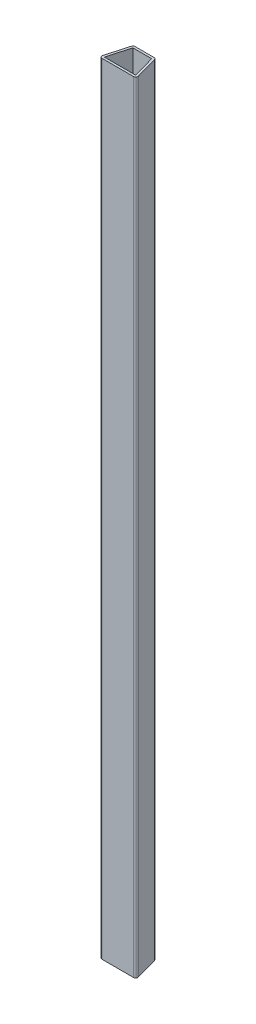
ISO-10303-21;
HEADER;
FILE_DESCRIPTION(('STEP AP214'),'2;1');
FILE_NAME('part.step','',(''),(''),'','','');
FILE_SCHEMA(('AUTOMOTIVE_DESIGN { 1 0 10303 214 1 1 1 1 }'));
ENDSEC;
DATA;
#1=APPLICATION_CONTEXT('core data for automotive mechanical design processes');
#2=APPLICATION_PROTOCOL_DEFINITION('international standard','automotive_design',2000,#1);
#3=PRODUCT_CONTEXT('',#1,'mechanical');
#4=PRODUCT('Part','Part','',(#3));
#5=PRODUCT_RELATED_PRODUCT_CATEGORY('part','',(#4));
#6=PRODUCT_DEFINITION_FORMATION('','',#4);
#7=PRODUCT_DEFINITION_CONTEXT('part definition',#1,'design');
#8=PRODUCT_DEFINITION('design','',#6,#7);
#9=PRODUCT_DEFINITION_SHAPE('','',#8);
#10=(LENGTH_UNIT() NAMED_UNIT(*) SI_UNIT(.MILLI.,.METRE.));
#11=(NAMED_UNIT(*) PLANE_ANGLE_UNIT() SI_UNIT($,.RADIAN.));
#12=(NAMED_UNIT(*) SI_UNIT($,.STERADIAN.) SOLID_ANGLE_UNIT());
#13=UNCERTAINTY_MEASURE_WITH_UNIT(LENGTH_MEASURE(1.E-05),#10,'distance_accuracy_value','');
#14=(GEOMETRIC_REPRESENTATION_CONTEXT(3) GLOBAL_UNCERTAINTY_ASSIGNED_CONTEXT((#13)) GLOBAL_UNIT_ASSIGNED_CONTEXT((#10,
#11,#12)) REPRESENTATION_CONTEXT('',''));
#15=CARTESIAN_POINT('',(0.,0.,0.));
#16=DIRECTION('',(0.,0.,1.));
#17=DIRECTION('',(1.,0.,0.));
#18=AXIS2_PLACEMENT_3D('',#15,#16,#17);
#19=CARTESIAN_POINT('',(-7.0398555990135,350.,5.));
#20=DIRECTION('',(0.,1.,0.));
#21=DIRECTION('',(0.,0.,1.));
#22=AXIS2_PLACEMENT_3D('',#19,#20,#21);
#23=PLANE('',#22);
#24=CARTESIAN_POINT('',(-7.0398555990135,350.,5.));
#25=DIRECTION('',(0.,1.,0.));
#26=DIRECTION('',(0.,0.,1.));
#27=AXIS2_PLACEMENT_3D('',#24,#25,#26);
#28=CIRCLE('',#27,1.);
#29=CARTESIAN_POINT('',(-8.0025065391674,350.,4.72925442308171));
#30=VERTEX_POINT('',#29);
#31=CARTESIAN_POINT('',(-7.03985559901349,350.,6.));
#32=VERTEX_POINT('',#31);
#33=EDGE_CURVE('E165',#30,#32,#28,.T.);
#34=ORIENTED_EDGE('',*,*,#33,.T.);
#35=DIRECTION('',(1.,0.,0.));
#36=VECTOR('',#35,1.);
#37=CARTESIAN_POINT('',(-7.03985559901349,350.,6.));
#38=LINE('',#37,#36);
#39=CARTESIAN_POINT('',(7.03985559901349,350.,6.));
#40=VERTEX_POINT('',#39);
#41=EDGE_CURVE('E164',#32,#40,#38,.T.);
#42=ORIENTED_EDGE('',*,*,#41,.T.);
#43=CARTESIAN_POINT('',(7.0398555990135,350.,5.));
#44=DIRECTION('',(0.,1.,0.));
#45=DIRECTION('',(0.,0.,-1.));
#46=AXIS2_PLACEMENT_3D('',#43,#44,#45);
#47=CIRCLE('',#46,1.);
#48=CARTESIAN_POINT('',(8.0025065391674,350.,4.72925442308171));
#49=VERTEX_POINT('',#48);
#50=EDGE_CURVE('E169',#40,#49,#47,.T.);
#51=ORIENTED_EDGE('',*,*,#50,.T.);
#52=DIRECTION('',(-0.270745576918284,0.,-0.962650940153899));
#53=VECTOR('',#52,1.);
#54=CARTESIAN_POINT('',(5.1900065391674,350.,-5.27074557691828));
#55=LINE('',#54,#53);
#56=CARTESIAN_POINT('',(5.1900065391674,350.,-5.27074557691828));
#57=VERTEX_POINT('',#56);
#58=EDGE_CURVE('E168',#49,#57,#55,.T.);
#59=ORIENTED_EDGE('',*,*,#58,.T.);
#60=CARTESIAN_POINT('',(4.2273555990135,350.,-5.));
#61=DIRECTION('',(0.,1.,0.));
#62=DIRECTION('',(0.,0.,1.));
#63=AXIS2_PLACEMENT_3D('',#60,#61,#62);
#64=CIRCLE('',#63,1.);
#65=CARTESIAN_POINT('',(4.22735559901349,350.,-6.));
#66=VERTEX_POINT('',#65);
#67=EDGE_CURVE('E175',#57,#66,#64,.T.);
#68=ORIENTED_EDGE('',*,*,#67,.T.);
#69=DIRECTION('',(-1.,0.,0.));
#70=VECTOR('',#69,1.);
#71=CARTESIAN_POINT('',(-4.22735559901349,350.,-6.));
#72=LINE('',#71,#70);
#73=CARTESIAN_POINT('',(-4.22735559901349,350.,-6.));
#74=VERTEX_POINT('',#73);
#75=EDGE_CURVE('E171',#66,#74,#72,.T.);
#76=ORIENTED_EDGE('',*,*,#75,.T.);
#77=CARTESIAN_POINT('',(-4.2273555990135,350.,-5.));
#78=DIRECTION('',(0.,1.,0.));
#79=DIRECTION('',(0.,0.,1.));
#80=AXIS2_PLACEMENT_3D('',#77,#78,#79);
#81=CIRCLE('',#80,1.);
#82=CARTESIAN_POINT('',(-5.1900065391674,350.,-5.27074557691828));
#83=VERTEX_POINT('',#82);
#84=EDGE_CURVE('E177',#74,#83,#81,.T.);
#85=ORIENTED_EDGE('',*,*,#84,.T.);
#86=DIRECTION('',(-0.270745576918284,0.,0.962650940153899));
#87=VECTOR('',#86,1.);
#88=CARTESIAN_POINT('',(-5.1900065391674,350.,-5.27074557691828));
#89=LINE('',#88,#87);
#90=EDGE_CURVE('E179',#83,#30,#89,.T.);
#91=ORIENTED_EDGE('',*,*,#90,.T.);
#92=EDGE_LOOP('',(#34,#42,#51,#59,#68,#76,#85,#91));
#93=FACE_BOUND('',#92,.T.);
#94=DIRECTION('',(1.,0.,0.));
#95=VECTOR('',#94,1.);
#96=CARTESIAN_POINT('',(-7.03985559901349,350.,5.));
#97=LINE('',#96,#95);
#98=CARTESIAN_POINT('',(-7.03985559901349,350.,5.));
#99=VERTEX_POINT('',#98);
#100=CARTESIAN_POINT('',(7.03985559901349,350.,5.));
#101=VERTEX_POINT('',#100);
#102=EDGE_CURVE('E131',#99,#101,#97,.T.);
#103=ORIENTED_EDGE('',*,*,#102,.F.);
#104=DIRECTION('',(-0.270745576918285,0.,0.962650940153899));
#105=VECTOR('',#104,1.);
#106=CARTESIAN_POINT('',(-4.22735559901349,350.,-5.));
#107=LINE('',#106,#105);
#108=CARTESIAN_POINT('',(-4.22735559901349,350.,-5.));
#109=VERTEX_POINT('',#108);
#110=EDGE_CURVE('E127',#109,#99,#107,.T.);
#111=ORIENTED_EDGE('',*,*,#110,.F.);
#112=DIRECTION('',(-1.,0.,0.));
#113=VECTOR('',#112,1.);
#114=CARTESIAN_POINT('',(-4.22735559901349,350.,-5.));
#115=LINE('',#114,#113);
#116=CARTESIAN_POINT('',(4.2273555990135,350.,-4.99999999999999));
#117=VERTEX_POINT('',#116);
#118=EDGE_CURVE('E146',#117,#109,#115,.T.);
#119=ORIENTED_EDGE('',*,*,#118,.F.);
#120=DIRECTION('',(-0.270745576918283,0.,-0.962650940153899));
#121=VECTOR('',#120,1.);
#122=CARTESIAN_POINT('',(4.2273555990135,350.,-4.99999999999999));
#123=LINE('',#122,#121);
#124=EDGE_CURVE('E148',#101,#117,#123,.T.);
#125=ORIENTED_EDGE('',*,*,#124,.F.);
#126=EDGE_LOOP('',(#103,#111,#119,#125));
#127=FACE_BOUND('',#126,.T.);
#128=ADVANCED_FACE('F40',(#93,#127),#23,.T.);
#129=CARTESIAN_POINT('',(-7.0398555990135,0.,5.));
#130=DIRECTION('',(0.,1.,0.));
#131=DIRECTION('',(0.,0.,1.));
#132=AXIS2_PLACEMENT_3D('',#129,#130,#131);
#133=PLANE('',#132);
#134=CARTESIAN_POINT('',(-7.0398555990135,0.,5.));
#135=DIRECTION('',(0.,1.,0.));
#136=DIRECTION('',(0.,0.,1.));
#137=AXIS2_PLACEMENT_3D('',#134,#135,#136);
#138=CIRCLE('',#137,1.);
#139=CARTESIAN_POINT('',(-8.0025065391674,0.,4.72925442308171));
#140=VERTEX_POINT('',#139);
#141=CARTESIAN_POINT('',(-7.03985559901349,0.,6.));
#142=VERTEX_POINT('',#141);
#143=EDGE_CURVE('E142',#140,#142,#138,.T.);
#144=ORIENTED_EDGE('',*,*,#143,.F.);
#145=DIRECTION('',(-0.270745576918284,0.,0.962650940153899));
#146=VECTOR('',#145,1.);
#147=CARTESIAN_POINT('',(-5.1900065391674,0.,-5.27074557691828));
#148=LINE('',#147,#146);
#149=CARTESIAN_POINT('',(-5.1900065391674,0.,-5.27074557691828));
#150=VERTEX_POINT('',#149);
#151=EDGE_CURVE('E167',#150,#140,#148,.T.);
#152=ORIENTED_EDGE('',*,*,#151,.F.);
#153=CARTESIAN_POINT('',(-4.2273555990135,0.,-5.));
#154=DIRECTION('',(0.,1.,0.));
#155=DIRECTION('',(0.,0.,1.));
#156=AXIS2_PLACEMENT_3D('',#153,#154,#155);
#157=CIRCLE('',#156,1.);
#158=CARTESIAN_POINT('',(-4.22735559901349,0.,-6.));
#159=VERTEX_POINT('',#158);
#160=EDGE_CURVE('E194',#159,#150,#157,.T.);
#161=ORIENTED_EDGE('',*,*,#160,.F.);
#162=DIRECTION('',(-1.,0.,0.));
#163=VECTOR('',#162,1.);
#164=CARTESIAN_POINT('',(-4.22735559901349,0.,-6.));
#165=LINE('',#164,#163);
#166=CARTESIAN_POINT('',(4.22735559901349,0.,-6.));
#167=VERTEX_POINT('',#166);
#168=EDGE_CURVE('E192',#167,#159,#165,.T.);
#169=ORIENTED_EDGE('',*,*,#168,.F.);
#170=CARTESIAN_POINT('',(4.2273555990135,0.,-5.));
#171=DIRECTION('',(0.,1.,0.));
#172=DIRECTION('',(0.,0.,1.));
#173=AXIS2_PLACEMENT_3D('',#170,#171,#172);
#174=CIRCLE('',#173,1.);
#175=CARTESIAN_POINT('',(5.1900065391674,0.,-5.27074557691828));
#176=VERTEX_POINT('',#175);
#177=EDGE_CURVE('E186',#176,#167,#174,.T.);
#178=ORIENTED_EDGE('',*,*,#177,.F.);
#179=DIRECTION('',(-0.270745576918284,0.,-0.962650940153899));
#180=VECTOR('',#179,1.);
#181=CARTESIAN_POINT('',(5.1900065391674,0.,-5.27074557691828));
#182=LINE('',#181,#180);
#183=CARTESIAN_POINT('',(8.0025065391674,0.,4.72925442308171));
#184=VERTEX_POINT('',#183);
#185=EDGE_CURVE('E190',#184,#176,#182,.T.);
#186=ORIENTED_EDGE('',*,*,#185,.F.);
#187=CARTESIAN_POINT('',(7.0398555990135,0.,5.));
#188=DIRECTION('',(0.,1.,0.));
#189=DIRECTION('',(0.,0.,-1.));
#190=AXIS2_PLACEMENT_3D('',#187,#188,#189);
#191=CIRCLE('',#190,1.);
#192=CARTESIAN_POINT('',(7.03985559901349,0.,6.));
#193=VERTEX_POINT('',#192);
#194=EDGE_CURVE('E183',#193,#184,#191,.T.);
#195=ORIENTED_EDGE('',*,*,#194,.F.);
#196=DIRECTION('',(1.,0.,0.));
#197=VECTOR('',#196,1.);
#198=CARTESIAN_POINT('',(-7.03985559901349,0.,6.));
#199=LINE('',#198,#197);
#200=EDGE_CURVE('E181',#142,#193,#199,.T.);
#201=ORIENTED_EDGE('',*,*,#200,.F.);
#202=EDGE_LOOP('',(#144,#152,#161,#169,#178,#186,#195,#201));
#203=FACE_BOUND('',#202,.T.);
#204=DIRECTION('',(-0.270745576918285,0.,0.962650940153899));
#205=VECTOR('',#204,1.);
#206=CARTESIAN_POINT('',(-4.22735559901349,0.,-5.));
#207=LINE('',#206,#205);
#208=CARTESIAN_POINT('',(-4.22735559901349,0.,-5.));
#209=VERTEX_POINT('',#208);
#210=CARTESIAN_POINT('',(-7.03985559901349,0.,5.));
#211=VERTEX_POINT('',#210);
#212=EDGE_CURVE('E58',#209,#211,#207,.T.);
#213=ORIENTED_EDGE('',*,*,#212,.T.);
#214=DIRECTION('',(1.,0.,0.));
#215=VECTOR('',#214,1.);
#216=CARTESIAN_POINT('',(-7.03985559901349,0.,5.));
#217=LINE('',#216,#215);
#218=CARTESIAN_POINT('',(7.03985559901349,0.,5.));
#219=VERTEX_POINT('',#218);
#220=EDGE_CURVE('E143',#211,#219,#217,.T.);
#221=ORIENTED_EDGE('',*,*,#220,.T.);
#222=DIRECTION('',(-0.270745576918283,0.,-0.962650940153899));
#223=VECTOR('',#222,1.);
#224=CARTESIAN_POINT('',(4.2273555990135,0.,-4.99999999999999));
#225=LINE('',#224,#223);
#226=CARTESIAN_POINT('',(4.2273555990135,0.,-4.99999999999999));
#227=VERTEX_POINT('',#226);
#228=EDGE_CURVE('E152',#219,#227,#225,.T.);
#229=ORIENTED_EDGE('',*,*,#228,.T.);
#230=DIRECTION('',(-1.,0.,0.));
#231=VECTOR('',#230,1.);
#232=CARTESIAN_POINT('',(-4.22735559901349,0.,-5.));
#233=LINE('',#232,#231);
#234=EDGE_CURVE('E133',#227,#209,#233,.T.);
#235=ORIENTED_EDGE('',*,*,#234,.T.);
#236=EDGE_LOOP('',(#213,#221,#229,#235));
#237=FACE_BOUND('',#236,.T.);
#238=ADVANCED_FACE('F224',(#203,#237),#133,.F.);
#239=CARTESIAN_POINT('',(-7.0398555990135,350.,5.));
#240=DIRECTION('',(0.,-1.,0.));
#241=DIRECTION('',(0.,0.,-1.));
#242=AXIS2_PLACEMENT_3D('',#239,#240,#241);
#243=CYLINDRICAL_SURFACE('',#242,1.);
#244=ORIENTED_EDGE('',*,*,#143,.T.);
#245=DIRECTION('',(0.,-1.,0.));
#246=VECTOR('',#245,1.);
#247=CARTESIAN_POINT('',(-7.03985559901349,350.,6.));
#248=LINE('',#247,#246);
#249=EDGE_CURVE('E11',#32,#142,#248,.T.);
#250=ORIENTED_EDGE('',*,*,#249,.F.);
#251=ORIENTED_EDGE('',*,*,#33,.F.);
#252=DIRECTION('',(0.,-1.,0.));
#253=VECTOR('',#252,1.);
#254=CARTESIAN_POINT('',(-8.0025065391674,350.,4.72925442308171));
#255=LINE('',#254,#253);
#256=EDGE_CURVE('E178',#30,#140,#255,.T.);
#257=ORIENTED_EDGE('',*,*,#256,.T.);
#258=EDGE_LOOP('',(#244,#250,#251,#257));
#259=FACE_BOUND('',#258,.T.);
#260=ADVANCED_FACE('F39',(#259),#243,.T.);
#261=CARTESIAN_POINT('',(-7.03985559901349,350.,6.));
#262=DIRECTION('',(0.,0.,-1.));
#263=DIRECTION('',(-1.,0.,0.));
#264=AXIS2_PLACEMENT_3D('',#261,#262,#263);
#265=PLANE('',#264);
#266=ORIENTED_EDGE('',*,*,#200,.T.);
#267=DIRECTION('',(0.,-1.,0.));
#268=VECTOR('',#267,1.);
#269=CARTESIAN_POINT('',(7.03985559901349,350.,6.));
#270=LINE('',#269,#268);
#271=EDGE_CURVE('E44',#40,#193,#270,.T.);
#272=ORIENTED_EDGE('',*,*,#271,.F.);
#273=ORIENTED_EDGE('',*,*,#41,.F.);
#274=ORIENTED_EDGE('',*,*,#249,.T.);
#275=EDGE_LOOP('',(#266,#272,#273,#274));
#276=FACE_BOUND('',#275,.T.);
#277=ADVANCED_FACE('F238',(#276),#265,.F.);
#278=CARTESIAN_POINT('',(7.0398555990135,350.,5.));
#279=DIRECTION('',(0.,-1.,0.));
#280=DIRECTION('',(0.,0.,-1.));
#281=AXIS2_PLACEMENT_3D('',#278,#279,#280);
#282=CYLINDRICAL_SURFACE('',#281,1.);
#283=ORIENTED_EDGE('',*,*,#194,.T.);
#284=DIRECTION('',(0.,-1.,0.));
#285=VECTOR('',#284,1.);
#286=CARTESIAN_POINT('',(8.0025065391674,350.,4.72925442308171));
#287=LINE('',#286,#285);
#288=EDGE_CURVE('E209',#49,#184,#287,.T.);
#289=ORIENTED_EDGE('',*,*,#288,.F.);
#290=ORIENTED_EDGE('',*,*,#50,.F.);
#291=ORIENTED_EDGE('',*,*,#271,.T.);
#292=EDGE_LOOP('',(#283,#289,#290,#291));
#293=FACE_BOUND('',#292,.T.);
#294=ADVANCED_FACE('F220',(#293),#282,.T.);
#295=CARTESIAN_POINT('',(5.1900065391674,350.,-5.27074557691828));
#296=DIRECTION('',(-0.962650940153899,0.,0.270745576918284));
#297=DIRECTION('',(0.270745576918284,0.,0.962650940153899));
#298=AXIS2_PLACEMENT_3D('',#295,#296,#297);
#299=PLANE('',#298);
#300=ORIENTED_EDGE('',*,*,#185,.T.);
#301=DIRECTION('',(0.,-1.,0.));
#302=VECTOR('',#301,1.);
#303=CARTESIAN_POINT('',(5.1900065391674,350.,-5.27074557691828));
#304=LINE('',#303,#302);
#305=EDGE_CURVE('E210',#57,#176,#304,.T.);
#306=ORIENTED_EDGE('',*,*,#305,.F.);
#307=ORIENTED_EDGE('',*,*,#58,.F.);
#308=ORIENTED_EDGE('',*,*,#288,.T.);
#309=EDGE_LOOP('',(#300,#306,#307,#308));
#310=FACE_BOUND('',#309,.T.);
#311=ADVANCED_FACE('F226',(#310),#299,.F.);
#312=CARTESIAN_POINT('',(4.2273555990135,350.,-5.));
#313=DIRECTION('',(0.,-1.,0.));
#314=DIRECTION('',(0.,0.,-1.));
#315=AXIS2_PLACEMENT_3D('',#312,#313,#314);
#316=CYLINDRICAL_SURFACE('',#315,1.);
#317=ORIENTED_EDGE('',*,*,#177,.T.);
#318=DIRECTION('',(0.,-1.,0.));
#319=VECTOR('',#318,1.);
#320=CARTESIAN_POINT('',(4.22735559901349,350.,-6.));
#321=LINE('',#320,#319);
#322=EDGE_CURVE('E204',#66,#167,#321,.T.);
#323=ORIENTED_EDGE('',*,*,#322,.F.);
#324=ORIENTED_EDGE('',*,*,#67,.F.);
#325=ORIENTED_EDGE('',*,*,#305,.T.);
#326=EDGE_LOOP('',(#317,#323,#324,#325));
#327=FACE_BOUND('',#326,.T.);
#328=ADVANCED_FACE('F234',(#327),#316,.T.);
#329=CARTESIAN_POINT('',(-4.22735559901349,350.,-6.));
#330=DIRECTION('',(0.,0.,1.));
#331=DIRECTION('',(1.,0.,0.));
#332=AXIS2_PLACEMENT_3D('',#329,#330,#331);
#333=PLANE('',#332);
#334=ORIENTED_EDGE('',*,*,#168,.T.);
#335=DIRECTION('',(0.,-1.,0.));
#336=VECTOR('',#335,1.);
#337=CARTESIAN_POINT('',(-4.22735559901349,350.,-6.));
#338=LINE('',#337,#336);
#339=EDGE_CURVE('E203',#74,#159,#338,.T.);
#340=ORIENTED_EDGE('',*,*,#339,.F.);
#341=ORIENTED_EDGE('',*,*,#75,.F.);
#342=ORIENTED_EDGE('',*,*,#322,.T.);
#343=EDGE_LOOP('',(#334,#340,#341,#342));
#344=FACE_BOUND('',#343,.T.);
#345=ADVANCED_FACE('F251',(#344),#333,.F.);
#346=CARTESIAN_POINT('',(-4.2273555990135,350.,-5.));
#347=DIRECTION('',(0.,-1.,0.));
#348=DIRECTION('',(0.,0.,-1.));
#349=AXIS2_PLACEMENT_3D('',#346,#347,#348);
#350=CYLINDRICAL_SURFACE('',#349,1.);
#351=ORIENTED_EDGE('',*,*,#160,.T.);
#352=DIRECTION('',(0.,-1.,0.));
#353=VECTOR('',#352,1.);
#354=CARTESIAN_POINT('',(-5.1900065391674,350.,-5.27074557691828));
#355=LINE('',#354,#353);
#356=EDGE_CURVE('E196',#83,#150,#355,.T.);
#357=ORIENTED_EDGE('',*,*,#356,.F.);
#358=ORIENTED_EDGE('',*,*,#84,.F.);
#359=ORIENTED_EDGE('',*,*,#339,.T.);
#360=EDGE_LOOP('',(#351,#357,#358,#359));
#361=FACE_BOUND('',#360,.T.);
#362=ADVANCED_FACE('F253',(#361),#350,.T.);
#363=CARTESIAN_POINT('',(-5.1900065391674,350.,-5.27074557691828));
#364=DIRECTION('',(0.962650940153899,0.,0.270745576918284));
#365=DIRECTION('',(0.270745576918284,0.,-0.962650940153899));
#366=AXIS2_PLACEMENT_3D('',#363,#364,#365);
#367=PLANE('',#366);
#368=ORIENTED_EDGE('',*,*,#151,.T.);
#369=ORIENTED_EDGE('',*,*,#256,.F.);
#370=ORIENTED_EDGE('',*,*,#90,.F.);
#371=ORIENTED_EDGE('',*,*,#356,.T.);
#372=EDGE_LOOP('',(#368,#369,#370,#371));
#373=FACE_BOUND('',#372,.T.);
#374=ADVANCED_FACE('F247',(#373),#367,.F.);
#375=CARTESIAN_POINT('',(-4.22735559901349,350.,-5.));
#376=DIRECTION('',(0.962650940153899,0.,0.270745576918285));
#377=DIRECTION('',(0.270745576918285,0.,-0.962650940153899));
#378=AXIS2_PLACEMENT_3D('',#375,#376,#377);
#379=PLANE('',#378);
#380=ORIENTED_EDGE('',*,*,#212,.F.);
#381=DIRECTION('',(0.,-1.,0.));
#382=VECTOR('',#381,1.);
#383=CARTESIAN_POINT('',(-4.22735559901349,350.,-5.));
#384=LINE('',#383,#382);
#385=EDGE_CURVE('E128',#109,#209,#384,.T.);
#386=ORIENTED_EDGE('',*,*,#385,.F.);
#387=ORIENTED_EDGE('',*,*,#110,.T.);
#388=DIRECTION('',(0.,-1.,0.));
#389=VECTOR('',#388,1.);
#390=CARTESIAN_POINT('',(-7.03985559901349,350.,5.));
#391=LINE('',#390,#389);
#392=EDGE_CURVE('E129',#99,#211,#391,.T.);
#393=ORIENTED_EDGE('',*,*,#392,.T.);
#394=EDGE_LOOP('',(#380,#386,#387,#393));
#395=FACE_BOUND('',#394,.T.);
#396=ADVANCED_FACE('F126',(#395),#379,.T.);
#397=CARTESIAN_POINT('',(-7.03985559901349,350.,5.));
#398=DIRECTION('',(0.,0.,-1.));
#399=DIRECTION('',(-1.,0.,0.));
#400=AXIS2_PLACEMENT_3D('',#397,#398,#399);
#401=PLANE('',#400);
#402=ORIENTED_EDGE('',*,*,#220,.F.);
#403=ORIENTED_EDGE('',*,*,#392,.F.);
#404=ORIENTED_EDGE('',*,*,#102,.T.);
#405=DIRECTION('',(0.,-1.,0.));
#406=VECTOR('',#405,1.);
#407=CARTESIAN_POINT('',(7.03985559901349,350.,5.));
#408=LINE('',#407,#406);
#409=EDGE_CURVE('E141',#101,#219,#408,.T.);
#410=ORIENTED_EDGE('',*,*,#409,.T.);
#411=EDGE_LOOP('',(#402,#403,#404,#410));
#412=FACE_BOUND('',#411,.T.);
#413=ADVANCED_FACE('F139',(#412),#401,.T.);
#414=CARTESIAN_POINT('',(4.2273555990135,350.,-4.99999999999999));
#415=DIRECTION('',(-0.962650940153899,0.,0.270745576918283));
#416=DIRECTION('',(0.270745576918283,0.,0.962650940153899));
#417=AXIS2_PLACEMENT_3D('',#414,#415,#416);
#418=PLANE('',#417);
#419=ORIENTED_EDGE('',*,*,#228,.F.);
#420=ORIENTED_EDGE('',*,*,#409,.F.);
#421=ORIENTED_EDGE('',*,*,#124,.T.);
#422=DIRECTION('',(0.,-1.,0.));
#423=VECTOR('',#422,1.);
#424=CARTESIAN_POINT('',(4.2273555990135,350.,-4.99999999999999));
#425=LINE('',#424,#423);
#426=EDGE_CURVE('E55',#117,#227,#425,.T.);
#427=ORIENTED_EDGE('',*,*,#426,.T.);
#428=EDGE_LOOP('',(#419,#420,#421,#427));
#429=FACE_BOUND('',#428,.T.);
#430=ADVANCED_FACE('F279',(#429),#418,.T.);
#431=CARTESIAN_POINT('',(-4.22735559901349,350.,-5.));
#432=DIRECTION('',(0.,0.,1.));
#433=DIRECTION('',(1.,0.,0.));
#434=AXIS2_PLACEMENT_3D('',#431,#432,#433);
#435=PLANE('',#434);
#436=ORIENTED_EDGE('',*,*,#234,.F.);
#437=ORIENTED_EDGE('',*,*,#426,.F.);
#438=ORIENTED_EDGE('',*,*,#118,.T.);
#439=ORIENTED_EDGE('',*,*,#385,.T.);
#440=EDGE_LOOP('',(#436,#437,#438,#439));
#441=FACE_BOUND('',#440,.T.);
#442=ADVANCED_FACE('F285',(#441),#435,.T.);
#443=CLOSED_SHELL('',(#128,#238,#260,#277,#294,#311,#328,#345,#362,#374,#396,#413,#430,#442));
#444=MANIFOLD_SOLID_BREP('B2',#443);
#445=ADVANCED_BREP_SHAPE_REPRESENTATION('',(#18,#444),#14);
#446=SHAPE_DEFINITION_REPRESENTATION(#9,#445);
ENDSEC;
END-ISO-10303-21;
